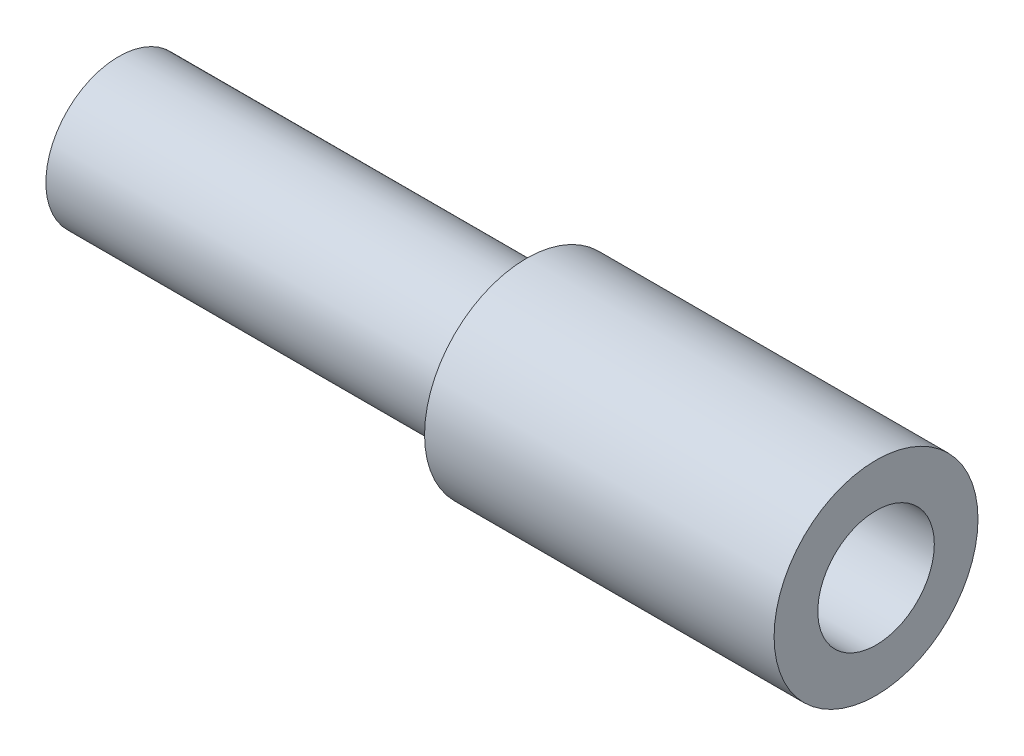
ISO-10303-21;
HEADER;
FILE_DESCRIPTION(('STEP AP214'),'2;1');
FILE_NAME('part.step','',(''),(''),'','','');
FILE_SCHEMA(('AUTOMOTIVE_DESIGN { 1 0 10303 214 1 1 1 1 }'));
ENDSEC;
DATA;
#1=APPLICATION_CONTEXT('core data for automotive mechanical design processes');
#2=APPLICATION_PROTOCOL_DEFINITION('international standard','automotive_design',2000,#1);
#3=PRODUCT_CONTEXT('',#1,'mechanical');
#4=PRODUCT('Part','Part','',(#3));
#5=PRODUCT_RELATED_PRODUCT_CATEGORY('part','',(#4));
#6=PRODUCT_DEFINITION_FORMATION('','',#4);
#7=PRODUCT_DEFINITION_CONTEXT('part definition',#1,'design');
#8=PRODUCT_DEFINITION('design','',#6,#7);
#9=PRODUCT_DEFINITION_SHAPE('','',#8);
#10=(LENGTH_UNIT() NAMED_UNIT(*) SI_UNIT(.MILLI.,.METRE.));
#11=(NAMED_UNIT(*) PLANE_ANGLE_UNIT() SI_UNIT($,.RADIAN.));
#12=(NAMED_UNIT(*) SI_UNIT($,.STERADIAN.) SOLID_ANGLE_UNIT());
#13=UNCERTAINTY_MEASURE_WITH_UNIT(LENGTH_MEASURE(1.E-05),#10,'distance_accuracy_value','');
#14=(GEOMETRIC_REPRESENTATION_CONTEXT(3) GLOBAL_UNCERTAINTY_ASSIGNED_CONTEXT((#13)) GLOBAL_UNIT_ASSIGNED_CONTEXT((#10,
#11,#12)) REPRESENTATION_CONTEXT('',''));
#15=CARTESIAN_POINT('',(0.,0.,0.));
#16=DIRECTION('',(0.,0.,1.));
#17=DIRECTION('',(1.,0.,0.));
#18=AXIS2_PLACEMENT_3D('',#15,#16,#17);
#19=CARTESIAN_POINT('',(0.,0.,0.));
#20=DIRECTION('',(1.,0.,0.));
#21=DIRECTION('',(0.,0.,-1.));
#22=AXIS2_PLACEMENT_3D('',#19,#20,#21);
#23=PLANE('',#22);
#24=CARTESIAN_POINT('',(0.,0.,0.));
#25=DIRECTION('',(1.,0.,0.));
#26=DIRECTION('',(0.,0.,-1.));
#27=AXIS2_PLACEMENT_3D('',#24,#25,#26);
#28=CIRCLE('',#27,12.5);
#29=CARTESIAN_POINT('',(0.,0.,-12.5));
#30=VERTEX_POINT('',#29);
#31=EDGE_CURVE('E42',#30,#30,#28,.T.);
#32=ORIENTED_EDGE('',*,*,#31,.F.);
#33=EDGE_LOOP('',(#32));
#34=FACE_BOUND('',#33,.T.);
#35=CARTESIAN_POINT('',(0.,0.,0.));
#36=DIRECTION('',(1.,0.,0.));
#37=DIRECTION('',(0.,0.,-1.));
#38=AXIS2_PLACEMENT_3D('',#35,#36,#37);
#39=CIRCLE('',#38,10.);
#40=CARTESIAN_POINT('',(0.,0.,-10.));
#41=VERTEX_POINT('',#40);
#42=EDGE_CURVE('E46',#41,#41,#39,.T.);
#43=ORIENTED_EDGE('',*,*,#42,.T.);
#44=EDGE_LOOP('',(#43));
#45=FACE_BOUND('',#44,.T.);
#46=ADVANCED_FACE('F31',(#34,#45),#23,.F.);
#47=CARTESIAN_POINT('',(70.,0.,0.));
#48=DIRECTION('',(-1.,0.,0.));
#49=DIRECTION('',(0.,0.,1.));
#50=AXIS2_PLACEMENT_3D('',#47,#48,#49);
#51=CYLINDRICAL_SURFACE('',#50,12.5);
#52=CARTESIAN_POINT('',(69.7,0.,0.));
#53=DIRECTION('',(1.,0.,0.));
#54=DIRECTION('',(0.,0.,-1.));
#55=AXIS2_PLACEMENT_3D('',#52,#53,#54);
#56=CIRCLE('',#55,12.5);
#57=CARTESIAN_POINT('',(69.7,0.,-12.5));
#58=VERTEX_POINT('',#57);
#59=EDGE_CURVE('E10',#58,#58,#56,.F.);
#60=ORIENTED_EDGE('',*,*,#59,.T.);
#61=EDGE_LOOP('',(#60));
#62=FACE_BOUND('',#61,.T.);
#63=ORIENTED_EDGE('',*,*,#31,.T.);
#64=EDGE_LOOP('',(#63));
#65=FACE_BOUND('',#64,.T.);
#66=ADVANCED_FACE('F77',(#62,#65),#51,.T.);
#67=CARTESIAN_POINT('',(70.,0.,0.));
#68=DIRECTION('',(-1.,0.,0.));
#69=DIRECTION('',(0.,0.,1.));
#70=AXIS2_PLACEMENT_3D('',#67,#68,#69);
#71=CYLINDRICAL_SURFACE('',#70,10.);
#72=ORIENTED_EDGE('',*,*,#42,.F.);
#73=EDGE_LOOP('',(#72));
#74=FACE_BOUND('',#73,.T.);
#75=CARTESIAN_POINT('',(130.,0.,0.));
#76=DIRECTION('',(1.,0.,0.));
#77=DIRECTION('',(0.,0.,-1.));
#78=AXIS2_PLACEMENT_3D('',#75,#76,#77);
#79=CIRCLE('',#78,10.);
#80=CARTESIAN_POINT('',(130.,0.,-10.));
#81=VERTEX_POINT('',#80);
#82=EDGE_CURVE('E55',#81,#81,#79,.T.);
#83=ORIENTED_EDGE('',*,*,#82,.T.);
#84=EDGE_LOOP('',(#83));
#85=FACE_BOUND('',#84,.T.);
#86=ADVANCED_FACE('F61',(#74,#85),#71,.F.);
#87=CARTESIAN_POINT('',(70.,0.,0.));
#88=DIRECTION('',(1.,0.,0.));
#89=DIRECTION('',(0.,0.,-1.));
#90=AXIS2_PLACEMENT_3D('',#87,#88,#89);
#91=PLANE('',#90);
#92=CARTESIAN_POINT('',(70.,0.,0.));
#93=DIRECTION('',(1.,0.,0.));
#94=DIRECTION('',(0.,0.,-1.));
#95=AXIS2_PLACEMENT_3D('',#92,#93,#94);
#96=CIRCLE('',#95,12.8);
#97=CARTESIAN_POINT('',(70.,0.,-12.8));
#98=VERTEX_POINT('',#97);
#99=EDGE_CURVE('E38',#98,#98,#96,.T.);
#100=ORIENTED_EDGE('',*,*,#99,.T.);
#101=EDGE_LOOP('',(#100));
#102=FACE_BOUND('',#101,.T.);
#103=CARTESIAN_POINT('',(70.,0.,0.));
#104=DIRECTION('',(1.,0.,0.));
#105=DIRECTION('',(0.,0.,-1.));
#106=AXIS2_PLACEMENT_3D('',#103,#104,#105);
#107=CIRCLE('',#106,17.5);
#108=CARTESIAN_POINT('',(70.,0.,-17.5));
#109=VERTEX_POINT('',#108);
#110=EDGE_CURVE('E52',#109,#109,#107,.T.);
#111=ORIENTED_EDGE('',*,*,#110,.F.);
#112=EDGE_LOOP('',(#111));
#113=FACE_BOUND('',#112,.T.);
#114=ADVANCED_FACE('F66',(#102,#113),#91,.F.);
#115=CARTESIAN_POINT('',(130.,0.,0.));
#116=DIRECTION('',(1.,0.,0.));
#117=DIRECTION('',(0.,0.,-1.));
#118=AXIS2_PLACEMENT_3D('',#115,#116,#117);
#119=PLANE('',#118);
#120=CARTESIAN_POINT('',(130.,0.,0.));
#121=DIRECTION('',(1.,0.,0.));
#122=DIRECTION('',(0.,0.,-1.));
#123=AXIS2_PLACEMENT_3D('',#120,#121,#122);
#124=CIRCLE('',#123,17.5);
#125=CARTESIAN_POINT('',(130.,0.,-17.5));
#126=VERTEX_POINT('',#125);
#127=EDGE_CURVE('E51',#126,#126,#124,.T.);
#128=ORIENTED_EDGE('',*,*,#127,.T.);
#129=EDGE_LOOP('',(#128));
#130=FACE_BOUND('',#129,.T.);
#131=ORIENTED_EDGE('',*,*,#82,.F.);
#132=EDGE_LOOP('',(#131));
#133=FACE_BOUND('',#132,.T.);
#134=ADVANCED_FACE('F63',(#130,#133),#119,.T.);
#135=CARTESIAN_POINT('',(130.,0.,0.));
#136=DIRECTION('',(-1.,0.,0.));
#137=DIRECTION('',(0.,0.,1.));
#138=AXIS2_PLACEMENT_3D('',#135,#136,#137);
#139=CYLINDRICAL_SURFACE('',#138,17.5);
#140=ORIENTED_EDGE('',*,*,#127,.F.);
#141=EDGE_LOOP('',(#140));
#142=FACE_BOUND('',#141,.T.);
#143=ORIENTED_EDGE('',*,*,#110,.T.);
#144=EDGE_LOOP('',(#143));
#145=FACE_BOUND('',#144,.T.);
#146=ADVANCED_FACE('F65',(#142,#145),#139,.T.);
#147=CARTESIAN_POINT('',(69.7,0.,0.));
#148=DIRECTION('',(1.,0.,0.));
#149=DIRECTION('',(0.,0.,-1.));
#150=AXIS2_PLACEMENT_3D('',#147,#148,#149);
#151=TOROIDAL_SURFACE('',#150,12.8,0.3);
#152=ORIENTED_EDGE('',*,*,#59,.F.);
#153=EDGE_LOOP('',(#152));
#154=FACE_BOUND('',#153,.T.);
#155=ORIENTED_EDGE('',*,*,#99,.F.);
#156=EDGE_LOOP('',(#155));
#157=FACE_BOUND('',#156,.T.);
#158=ADVANCED_FACE('F33',(#154,#157),#151,.F.);
#159=CLOSED_SHELL('',(#46,#66,#86,#114,#134,#146,#158));
#160=MANIFOLD_SOLID_BREP('B2',#159);
#161=ADVANCED_BREP_SHAPE_REPRESENTATION('',(#18,#160),#14);
#162=SHAPE_DEFINITION_REPRESENTATION(#9,#161);
ENDSEC;
END-ISO-10303-21;
